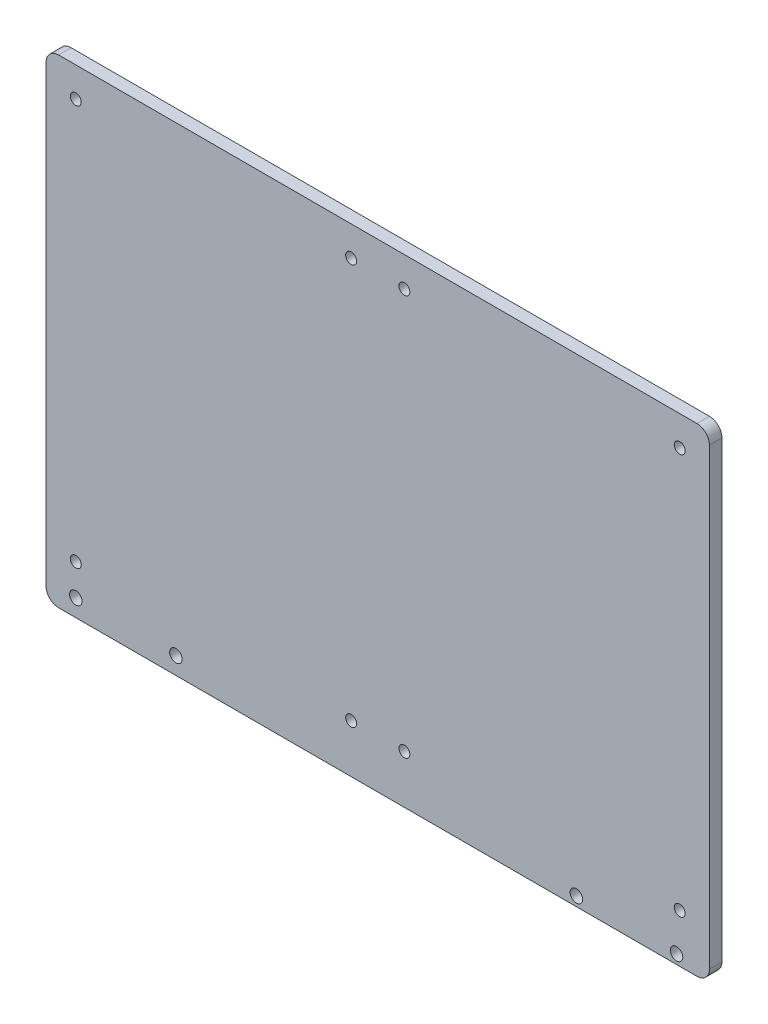
ISO-10303-21;
HEADER;
FILE_DESCRIPTION(('STEP AP214'),'2;1');
FILE_NAME('part.step','',(''),(''),'','','');
FILE_SCHEMA(('AUTOMOTIVE_DESIGN { 1 0 10303 214 1 1 1 1 }'));
ENDSEC;
DATA;
#1=APPLICATION_CONTEXT('core data for automotive mechanical design processes');
#2=APPLICATION_PROTOCOL_DEFINITION('international standard','automotive_design',2000,#1);
#3=PRODUCT_CONTEXT('',#1,'mechanical');
#4=PRODUCT('Part','Part','',(#3));
#5=PRODUCT_RELATED_PRODUCT_CATEGORY('part','',(#4));
#6=PRODUCT_DEFINITION_FORMATION('','',#4);
#7=PRODUCT_DEFINITION_CONTEXT('part definition',#1,'design');
#8=PRODUCT_DEFINITION('design','',#6,#7);
#9=PRODUCT_DEFINITION_SHAPE('','',#8);
#10=(LENGTH_UNIT() NAMED_UNIT(*) SI_UNIT(.MILLI.,.METRE.));
#11=(NAMED_UNIT(*) PLANE_ANGLE_UNIT() SI_UNIT($,.RADIAN.));
#12=(NAMED_UNIT(*) SI_UNIT($,.STERADIAN.) SOLID_ANGLE_UNIT());
#13=UNCERTAINTY_MEASURE_WITH_UNIT(LENGTH_MEASURE(1.E-05),#10,'distance_accuracy_value','');
#14=(GEOMETRIC_REPRESENTATION_CONTEXT(3) GLOBAL_UNCERTAINTY_ASSIGNED_CONTEXT((#13)) GLOBAL_UNIT_ASSIGNED_CONTEXT((#10,
#11,#12)) REPRESENTATION_CONTEXT('',''));
#15=CARTESIAN_POINT('',(0.,0.,0.));
#16=DIRECTION('',(0.,0.,1.));
#17=DIRECTION('',(1.,0.,0.));
#18=AXIS2_PLACEMENT_3D('',#15,#16,#17);
#19=CARTESIAN_POINT('',(0.,0.,4.));
#20=DIRECTION('',(0.,0.,1.));
#21=DIRECTION('',(1.,0.,0.));
#22=AXIS2_PLACEMENT_3D('',#19,#20,#21);
#23=PLANE('',#22);
#24=CARTESIAN_POINT('',(-64.5,-71.,4.));
#25=DIRECTION('',(0.,0.,1.));
#26=DIRECTION('',(1.,0.,0.));
#27=AXIS2_PLACEMENT_3D('',#24,#25,#26);
#28=CIRCLE('',#27,2.);
#29=CARTESIAN_POINT('',(-62.5,-71.,4.));
#30=VERTEX_POINT('',#29);
#31=EDGE_CURVE('E214',#30,#30,#28,.T.);
#32=ORIENTED_EDGE('',*,*,#31,.F.);
#33=EDGE_LOOP('',(#32));
#34=FACE_BOUND('',#33,.T.);
#35=CARTESIAN_POINT('',(-96.5,-71.,4.));
#36=DIRECTION('',(0.,0.,1.));
#37=DIRECTION('',(1.,0.,0.));
#38=AXIS2_PLACEMENT_3D('',#35,#36,#37);
#39=CIRCLE('',#38,2.);
#40=CARTESIAN_POINT('',(-94.5,-71.,4.));
#41=VERTEX_POINT('',#40);
#42=EDGE_CURVE('E226',#41,#41,#39,.T.);
#43=ORIENTED_EDGE('',*,*,#42,.F.);
#44=EDGE_LOOP('',(#43));
#45=FACE_BOUND('',#44,.T.);
#46=CARTESIAN_POINT('',(8.50000000000005,67.,4.));
#47=DIRECTION('',(0.,0.,1.));
#48=DIRECTION('',(-1.,0.,0.));
#49=AXIS2_PLACEMENT_3D('',#46,#47,#48);
#50=CIRCLE('',#49,1.75);
#51=CARTESIAN_POINT('',(6.75000000000005,67.,4.));
#52=VERTEX_POINT('',#51);
#53=EDGE_CURVE('E236',#52,#52,#50,.T.);
#54=ORIENTED_EDGE('',*,*,#53,.F.);
#55=EDGE_LOOP('',(#54));
#56=FACE_BOUND('',#55,.T.);
#57=CARTESIAN_POINT('',(-96.5,67.,4.));
#58=DIRECTION('',(0.,0.,1.));
#59=DIRECTION('',(-1.,0.,0.));
#60=AXIS2_PLACEMENT_3D('',#57,#58,#59);
#61=CIRCLE('',#60,1.75);
#62=CARTESIAN_POINT('',(-98.25,67.,4.));
#63=VERTEX_POINT('',#62);
#64=EDGE_CURVE('E246',#63,#63,#61,.T.);
#65=ORIENTED_EDGE('',*,*,#64,.F.);
#66=EDGE_LOOP('',(#65));
#67=FACE_BOUND('',#66,.T.);
#68=CARTESIAN_POINT('',(8.50000000000005,-61.,4.));
#69=DIRECTION('',(0.,0.,1.));
#70=DIRECTION('',(1.,0.,0.));
#71=AXIS2_PLACEMENT_3D('',#68,#69,#70);
#72=CIRCLE('',#71,1.75);
#73=CARTESIAN_POINT('',(10.25,-61.,4.));
#74=VERTEX_POINT('',#73);
#75=EDGE_CURVE('E256',#74,#74,#72,.T.);
#76=ORIENTED_EDGE('',*,*,#75,.F.);
#77=EDGE_LOOP('',(#76));
#78=FACE_BOUND('',#77,.T.);
#79=CARTESIAN_POINT('',(-96.5,-61.,4.));
#80=DIRECTION('',(0.,0.,1.));
#81=DIRECTION('',(1.,0.,0.));
#82=AXIS2_PLACEMENT_3D('',#79,#80,#81);
#83=CIRCLE('',#82,1.75);
#84=CARTESIAN_POINT('',(-94.75,-61.,4.));
#85=VERTEX_POINT('',#84);
#86=EDGE_CURVE('E136',#85,#85,#83,.T.);
#87=ORIENTED_EDGE('',*,*,#86,.F.);
#88=EDGE_LOOP('',(#87));
#89=FACE_BOUND('',#88,.T.);
#90=DIRECTION('',(0.,-1.,0.));
#91=VECTOR('',#90,1.);
#92=CARTESIAN_POINT('',(-106.,-76.5,4.));
#93=LINE('',#92,#91);
#94=CARTESIAN_POINT('',(-106.,72.4999999999999,4.));
#95=VERTEX_POINT('',#94);
#96=CARTESIAN_POINT('',(-106.,-72.5,4.));
#97=VERTEX_POINT('',#96);
#98=EDGE_CURVE('E141',#95,#97,#93,.T.);
#99=ORIENTED_EDGE('',*,*,#98,.T.);
#100=CARTESIAN_POINT('',(-102.,-72.5,4.));
#101=DIRECTION('',(0.,0.,1.));
#102=DIRECTION('',(1.,0.,0.));
#103=AXIS2_PLACEMENT_3D('',#100,#101,#102);
#104=CIRCLE('',#103,4.);
#105=CARTESIAN_POINT('',(-102.,-76.5,4.));
#106=VERTEX_POINT('',#105);
#107=EDGE_CURVE('E156',#97,#106,#104,.T.);
#108=ORIENTED_EDGE('',*,*,#107,.T.);
#109=DIRECTION('',(1.,0.,0.));
#110=VECTOR('',#109,1.);
#111=CARTESIAN_POINT('',(106.,-76.5,4.));
#112=LINE('',#111,#110);
#113=CARTESIAN_POINT('',(102.,-76.5,4.));
#114=VERTEX_POINT('',#113);
#115=EDGE_CURVE('E123',#106,#114,#112,.T.);
#116=ORIENTED_EDGE('',*,*,#115,.T.);
#117=CARTESIAN_POINT('',(102.,-72.5,4.));
#118=DIRECTION('',(0.,0.,1.));
#119=DIRECTION('',(1.,0.,0.));
#120=AXIS2_PLACEMENT_3D('',#117,#118,#119);
#121=CIRCLE('',#120,4.);
#122=CARTESIAN_POINT('',(106.,-72.5,4.));
#123=VERTEX_POINT('',#122);
#124=EDGE_CURVE('E154',#114,#123,#121,.T.);
#125=ORIENTED_EDGE('',*,*,#124,.T.);
#126=DIRECTION('',(0.,1.,0.));
#127=VECTOR('',#126,1.);
#128=CARTESIAN_POINT('',(106.,-76.5,4.));
#129=LINE('',#128,#127);
#130=CARTESIAN_POINT('',(106.,72.5,4.));
#131=VERTEX_POINT('',#130);
#132=EDGE_CURVE('E176',#123,#131,#129,.T.);
#133=ORIENTED_EDGE('',*,*,#132,.T.);
#134=CARTESIAN_POINT('',(102.,72.5,4.));
#135=DIRECTION('',(0.,0.,1.));
#136=DIRECTION('',(1.,0.,0.));
#137=AXIS2_PLACEMENT_3D('',#134,#135,#136);
#138=CIRCLE('',#137,4.);
#139=CARTESIAN_POINT('',(102.,76.5,4.));
#140=VERTEX_POINT('',#139);
#141=EDGE_CURVE('E58',#131,#140,#138,.T.);
#142=ORIENTED_EDGE('',*,*,#141,.T.);
#143=DIRECTION('',(-1.,0.,0.));
#144=VECTOR('',#143,1.);
#145=CARTESIAN_POINT('',(106.,76.5,4.));
#146=LINE('',#145,#144);
#147=CARTESIAN_POINT('',(-102.,76.4999999999999,4.));
#148=VERTEX_POINT('',#147);
#149=EDGE_CURVE('E142',#140,#148,#146,.T.);
#150=ORIENTED_EDGE('',*,*,#149,.T.);
#151=CARTESIAN_POINT('',(-102.,72.4999999999999,4.));
#152=DIRECTION('',(0.,0.,1.));
#153=DIRECTION('',(1.,0.,0.));
#154=AXIS2_PLACEMENT_3D('',#151,#152,#153);
#155=CIRCLE('',#154,4.);
#156=EDGE_CURVE('E152',#148,#95,#155,.T.);
#157=ORIENTED_EDGE('',*,*,#156,.T.);
#158=EDGE_LOOP('',(#99,#108,#116,#125,#133,#142,#150,#157));
#159=FACE_BOUND('',#158,.T.);
#160=CARTESIAN_POINT('',(-8.50000000000002,-61.,4.));
#161=DIRECTION('',(0.,0.,1.));
#162=DIRECTION('',(-1.,0.,0.));
#163=AXIS2_PLACEMENT_3D('',#160,#161,#162);
#164=CIRCLE('',#163,1.75);
#165=CARTESIAN_POINT('',(-10.25,-61.,4.));
#166=VERTEX_POINT('',#165);
#167=EDGE_CURVE('E189',#166,#166,#164,.T.);
#168=ORIENTED_EDGE('',*,*,#167,.F.);
#169=EDGE_LOOP('',(#168));
#170=FACE_BOUND('',#169,.T.);
#171=CARTESIAN_POINT('',(96.5000000000001,-61.,4.));
#172=DIRECTION('',(0.,0.,1.));
#173=DIRECTION('',(-1.,0.,0.));
#174=AXIS2_PLACEMENT_3D('',#171,#172,#173);
#175=CIRCLE('',#174,1.75);
#176=CARTESIAN_POINT('',(94.7500000000001,-61.,4.));
#177=VERTEX_POINT('',#176);
#178=EDGE_CURVE('E193',#177,#177,#175,.T.);
#179=ORIENTED_EDGE('',*,*,#178,.F.);
#180=EDGE_LOOP('',(#179));
#181=FACE_BOUND('',#180,.T.);
#182=CARTESIAN_POINT('',(96.5000000000001,67.,4.));
#183=DIRECTION('',(0.,0.,1.));
#184=DIRECTION('',(1.,0.,0.));
#185=AXIS2_PLACEMENT_3D('',#182,#183,#184);
#186=CIRCLE('',#185,1.75);
#187=CARTESIAN_POINT('',(98.2500000000001,67.,4.));
#188=VERTEX_POINT('',#187);
#189=EDGE_CURVE('E197',#188,#188,#186,.T.);
#190=ORIENTED_EDGE('',*,*,#189,.F.);
#191=EDGE_LOOP('',(#190));
#192=FACE_BOUND('',#191,.T.);
#193=CARTESIAN_POINT('',(-8.50000000000002,67.,4.));
#194=DIRECTION('',(0.,0.,1.));
#195=DIRECTION('',(1.,0.,0.));
#196=AXIS2_PLACEMENT_3D('',#193,#194,#195);
#197=CIRCLE('',#196,1.75);
#198=CARTESIAN_POINT('',(-6.75000000000002,67.,4.));
#199=VERTEX_POINT('',#198);
#200=EDGE_CURVE('E201',#199,#199,#197,.T.);
#201=ORIENTED_EDGE('',*,*,#200,.F.);
#202=EDGE_LOOP('',(#201));
#203=FACE_BOUND('',#202,.T.);
#204=CARTESIAN_POINT('',(95.4803109760698,-73.51,4.));
#205=DIRECTION('',(0.,0.,1.));
#206=DIRECTION('',(-1.,0.,0.));
#207=AXIS2_PLACEMENT_3D('',#204,#205,#206);
#208=CIRCLE('',#207,2.);
#209=CARTESIAN_POINT('',(93.4803109760698,-73.51,4.));
#210=VERTEX_POINT('',#209);
#211=EDGE_CURVE('E205',#210,#210,#208,.T.);
#212=ORIENTED_EDGE('',*,*,#211,.F.);
#213=EDGE_LOOP('',(#212));
#214=FACE_BOUND('',#213,.T.);
#215=CARTESIAN_POINT('',(63.4803109760698,-73.51,4.));
#216=DIRECTION('',(0.,0.,1.));
#217=DIRECTION('',(1.,0.,0.));
#218=AXIS2_PLACEMENT_3D('',#215,#216,#217);
#219=CIRCLE('',#218,2.);
#220=CARTESIAN_POINT('',(65.4803109760698,-73.51,4.));
#221=VERTEX_POINT('',#220);
#222=EDGE_CURVE('E208',#221,#221,#219,.T.);
#223=ORIENTED_EDGE('',*,*,#222,.F.);
#224=EDGE_LOOP('',(#223));
#225=FACE_BOUND('',#224,.T.);
#226=ADVANCED_FACE('F38',(#34,#45,#56,#67,#78,#89,#159,#170,#181,#192,#203,#214,#225),#23,.T.);
#227=CARTESIAN_POINT('',(0.,0.,0.));
#228=DIRECTION('',(0.,0.,1.));
#229=DIRECTION('',(1.,0.,0.));
#230=AXIS2_PLACEMENT_3D('',#227,#228,#229);
#231=PLANE('',#230);
#232=DIRECTION('',(1.,0.,0.));
#233=VECTOR('',#232,1.);
#234=CARTESIAN_POINT('',(106.,-76.5,0.));
#235=LINE('',#234,#233);
#236=CARTESIAN_POINT('',(-102.,-76.5,0.));
#237=VERTEX_POINT('',#236);
#238=CARTESIAN_POINT('',(102.,-76.5,0.));
#239=VERTEX_POINT('',#238);
#240=EDGE_CURVE('E120',#237,#239,#235,.T.);
#241=ORIENTED_EDGE('',*,*,#240,.F.);
#242=CARTESIAN_POINT('',(-102.,-72.5,0.));
#243=DIRECTION('',(0.,0.,1.));
#244=DIRECTION('',(1.,0.,0.));
#245=AXIS2_PLACEMENT_3D('',#242,#243,#244);
#246=CIRCLE('',#245,4.);
#247=CARTESIAN_POINT('',(-106.,-72.5,0.));
#248=VERTEX_POINT('',#247);
#249=EDGE_CURVE('E103',#237,#248,#246,.F.);
#250=ORIENTED_EDGE('',*,*,#249,.T.);
#251=DIRECTION('',(0.,-1.,0.));
#252=VECTOR('',#251,1.);
#253=CARTESIAN_POINT('',(-106.,-76.5,0.));
#254=LINE('',#253,#252);
#255=CARTESIAN_POINT('',(-106.,72.4999999999999,0.));
#256=VERTEX_POINT('',#255);
#257=EDGE_CURVE('E131',#256,#248,#254,.T.);
#258=ORIENTED_EDGE('',*,*,#257,.F.);
#259=CARTESIAN_POINT('',(-102.,72.4999999999999,0.));
#260=DIRECTION('',(0.,0.,1.));
#261=DIRECTION('',(1.,0.,0.));
#262=AXIS2_PLACEMENT_3D('',#259,#260,#261);
#263=CIRCLE('',#262,4.);
#264=CARTESIAN_POINT('',(-102.,76.4999999999999,0.));
#265=VERTEX_POINT('',#264);
#266=EDGE_CURVE('E145',#256,#265,#263,.F.);
#267=ORIENTED_EDGE('',*,*,#266,.T.);
#268=DIRECTION('',(-1.,0.,0.));
#269=VECTOR('',#268,1.);
#270=CARTESIAN_POINT('',(106.,76.5,0.));
#271=LINE('',#270,#269);
#272=CARTESIAN_POINT('',(102.,76.5,0.));
#273=VERTEX_POINT('',#272);
#274=EDGE_CURVE('E134',#273,#265,#271,.T.);
#275=ORIENTED_EDGE('',*,*,#274,.F.);
#276=CARTESIAN_POINT('',(102.,72.5,0.));
#277=DIRECTION('',(0.,0.,1.));
#278=DIRECTION('',(1.,0.,0.));
#279=AXIS2_PLACEMENT_3D('',#276,#277,#278);
#280=CIRCLE('',#279,4.);
#281=CARTESIAN_POINT('',(106.,72.5,0.));
#282=VERTEX_POINT('',#281);
#283=EDGE_CURVE('E124',#273,#282,#280,.F.);
#284=ORIENTED_EDGE('',*,*,#283,.T.);
#285=DIRECTION('',(0.,1.,0.));
#286=VECTOR('',#285,1.);
#287=CARTESIAN_POINT('',(106.,-76.5,0.));
#288=LINE('',#287,#286);
#289=CARTESIAN_POINT('',(106.,-72.5,0.));
#290=VERTEX_POINT('',#289);
#291=EDGE_CURVE('E130',#290,#282,#288,.T.);
#292=ORIENTED_EDGE('',*,*,#291,.F.);
#293=CARTESIAN_POINT('',(102.,-72.5,0.));
#294=DIRECTION('',(0.,0.,1.));
#295=DIRECTION('',(1.,0.,0.));
#296=AXIS2_PLACEMENT_3D('',#293,#294,#295);
#297=CIRCLE('',#296,4.);
#298=EDGE_CURVE('E114',#290,#239,#297,.F.);
#299=ORIENTED_EDGE('',*,*,#298,.T.);
#300=EDGE_LOOP('',(#241,#250,#258,#267,#275,#284,#292,#299));
#301=FACE_BOUND('',#300,.T.);
#302=CARTESIAN_POINT('',(-96.5,-61.,0.));
#303=DIRECTION('',(0.,0.,1.));
#304=DIRECTION('',(1.,0.,0.));
#305=AXIS2_PLACEMENT_3D('',#302,#303,#304);
#306=CIRCLE('',#305,1.75);
#307=CARTESIAN_POINT('',(-94.75,-61.,0.));
#308=VERTEX_POINT('',#307);
#309=EDGE_CURVE('E179',#308,#308,#306,.T.);
#310=ORIENTED_EDGE('',*,*,#309,.T.);
#311=EDGE_LOOP('',(#310));
#312=FACE_BOUND('',#311,.T.);
#313=CARTESIAN_POINT('',(-8.50000000000002,-61.,0.));
#314=DIRECTION('',(0.,0.,1.));
#315=DIRECTION('',(-1.,0.,0.));
#316=AXIS2_PLACEMENT_3D('',#313,#314,#315);
#317=CIRCLE('',#316,1.75);
#318=CARTESIAN_POINT('',(-10.25,-61.,0.));
#319=VERTEX_POINT('',#318);
#320=EDGE_CURVE('E259',#319,#319,#317,.T.);
#321=ORIENTED_EDGE('',*,*,#320,.T.);
#322=EDGE_LOOP('',(#321));
#323=FACE_BOUND('',#322,.T.);
#324=CARTESIAN_POINT('',(8.50000000000005,-61.,0.));
#325=DIRECTION('',(0.,0.,1.));
#326=DIRECTION('',(1.,0.,0.));
#327=AXIS2_PLACEMENT_3D('',#324,#325,#326);
#328=CIRCLE('',#327,1.75);
#329=CARTESIAN_POINT('',(10.25,-61.,0.));
#330=VERTEX_POINT('',#329);
#331=EDGE_CURVE('E253',#330,#330,#328,.T.);
#332=ORIENTED_EDGE('',*,*,#331,.T.);
#333=EDGE_LOOP('',(#332));
#334=FACE_BOUND('',#333,.T.);
#335=CARTESIAN_POINT('',(96.5000000000001,-61.,0.));
#336=DIRECTION('',(0.,0.,1.));
#337=DIRECTION('',(-1.,0.,0.));
#338=AXIS2_PLACEMENT_3D('',#335,#336,#337);
#339=CIRCLE('',#338,1.75);
#340=CARTESIAN_POINT('',(94.7500000000001,-61.,0.));
#341=VERTEX_POINT('',#340);
#342=EDGE_CURVE('E249',#341,#341,#339,.T.);
#343=ORIENTED_EDGE('',*,*,#342,.T.);
#344=EDGE_LOOP('',(#343));
#345=FACE_BOUND('',#344,.T.);
#346=CARTESIAN_POINT('',(-96.5,67.,0.));
#347=DIRECTION('',(0.,0.,1.));
#348=DIRECTION('',(-1.,0.,0.));
#349=AXIS2_PLACEMENT_3D('',#346,#347,#348);
#350=CIRCLE('',#349,1.75);
#351=CARTESIAN_POINT('',(-98.25,67.,0.));
#352=VERTEX_POINT('',#351);
#353=EDGE_CURVE('E243',#352,#352,#350,.T.);
#354=ORIENTED_EDGE('',*,*,#353,.T.);
#355=EDGE_LOOP('',(#354));
#356=FACE_BOUND('',#355,.T.);
#357=CARTESIAN_POINT('',(96.5000000000001,67.,0.));
#358=DIRECTION('',(0.,0.,1.));
#359=DIRECTION('',(1.,0.,0.));
#360=AXIS2_PLACEMENT_3D('',#357,#358,#359);
#361=CIRCLE('',#360,1.75);
#362=CARTESIAN_POINT('',(98.2500000000001,67.,0.));
#363=VERTEX_POINT('',#362);
#364=EDGE_CURVE('E239',#363,#363,#361,.T.);
#365=ORIENTED_EDGE('',*,*,#364,.T.);
#366=EDGE_LOOP('',(#365));
#367=FACE_BOUND('',#366,.T.);
#368=CARTESIAN_POINT('',(8.50000000000005,67.,0.));
#369=DIRECTION('',(0.,0.,1.));
#370=DIRECTION('',(-1.,0.,0.));
#371=AXIS2_PLACEMENT_3D('',#368,#369,#370);
#372=CIRCLE('',#371,1.75);
#373=CARTESIAN_POINT('',(6.75000000000005,67.,0.));
#374=VERTEX_POINT('',#373);
#375=EDGE_CURVE('E233',#374,#374,#372,.T.);
#376=ORIENTED_EDGE('',*,*,#375,.T.);
#377=EDGE_LOOP('',(#376));
#378=FACE_BOUND('',#377,.T.);
#379=CARTESIAN_POINT('',(-8.50000000000002,67.,0.));
#380=DIRECTION('',(0.,0.,1.));
#381=DIRECTION('',(1.,0.,0.));
#382=AXIS2_PLACEMENT_3D('',#379,#380,#381);
#383=CIRCLE('',#382,1.75);
#384=CARTESIAN_POINT('',(-6.75000000000002,67.,0.));
#385=VERTEX_POINT('',#384);
#386=EDGE_CURVE('E229',#385,#385,#383,.T.);
#387=ORIENTED_EDGE('',*,*,#386,.T.);
#388=EDGE_LOOP('',(#387));
#389=FACE_BOUND('',#388,.T.);
#390=CARTESIAN_POINT('',(-96.5,-71.,0.));
#391=DIRECTION('',(0.,0.,1.));
#392=DIRECTION('',(1.,0.,0.));
#393=AXIS2_PLACEMENT_3D('',#390,#391,#392);
#394=CIRCLE('',#393,2.);
#395=CARTESIAN_POINT('',(-94.5,-71.,0.));
#396=VERTEX_POINT('',#395);
#397=EDGE_CURVE('E223',#396,#396,#394,.T.);
#398=ORIENTED_EDGE('',*,*,#397,.T.);
#399=EDGE_LOOP('',(#398));
#400=FACE_BOUND('',#399,.T.);
#401=CARTESIAN_POINT('',(95.4803109760698,-73.51,0.));
#402=DIRECTION('',(0.,0.,1.));
#403=DIRECTION('',(-1.,0.,0.));
#404=AXIS2_PLACEMENT_3D('',#401,#402,#403);
#405=CIRCLE('',#404,2.);
#406=CARTESIAN_POINT('',(93.4803109760698,-73.51,0.));
#407=VERTEX_POINT('',#406);
#408=EDGE_CURVE('E220',#407,#407,#405,.T.);
#409=ORIENTED_EDGE('',*,*,#408,.T.);
#410=EDGE_LOOP('',(#409));
#411=FACE_BOUND('',#410,.T.);
#412=CARTESIAN_POINT('',(-64.5,-71.,0.));
#413=DIRECTION('',(0.,0.,1.));
#414=DIRECTION('',(1.,0.,0.));
#415=AXIS2_PLACEMENT_3D('',#412,#413,#414);
#416=CIRCLE('',#415,2.);
#417=CARTESIAN_POINT('',(-62.5,-71.,0.));
#418=VERTEX_POINT('',#417);
#419=EDGE_CURVE('E210',#418,#418,#416,.T.);
#420=ORIENTED_EDGE('',*,*,#419,.T.);
#421=EDGE_LOOP('',(#420));
#422=FACE_BOUND('',#421,.T.);
#423=CARTESIAN_POINT('',(63.4803109760698,-73.51,0.));
#424=DIRECTION('',(0.,0.,1.));
#425=DIRECTION('',(1.,0.,0.));
#426=AXIS2_PLACEMENT_3D('',#423,#424,#425);
#427=CIRCLE('',#426,2.);
#428=CARTESIAN_POINT('',(65.4803109760698,-73.51,0.));
#429=VERTEX_POINT('',#428);
#430=EDGE_CURVE('E211',#429,#429,#427,.T.);
#431=ORIENTED_EDGE('',*,*,#430,.T.);
#432=EDGE_LOOP('',(#431));
#433=FACE_BOUND('',#432,.T.);
#434=ADVANCED_FACE('F127',(#301,#312,#323,#334,#345,#356,#367,#378,#389,#400,#411,#422,#433),
#231,.F.);
#435=CARTESIAN_POINT('',(-106.,-76.5,4.));
#436=DIRECTION('',(1.,0.,0.));
#437=DIRECTION('',(0.,1.,0.));
#438=AXIS2_PLACEMENT_3D('',#435,#436,#437);
#439=PLANE('',#438);
#440=ORIENTED_EDGE('',*,*,#257,.T.);
#441=DIRECTION('',(0.,0.,-1.));
#442=VECTOR('',#441,1.);
#443=CARTESIAN_POINT('',(-106.,-72.5,4.));
#444=LINE('',#443,#442);
#445=EDGE_CURVE('E108',#248,#97,#444,.F.);
#446=ORIENTED_EDGE('',*,*,#445,.T.);
#447=ORIENTED_EDGE('',*,*,#98,.F.);
#448=DIRECTION('',(0.,0.,-1.));
#449=VECTOR('',#448,1.);
#450=CARTESIAN_POINT('',(-106.,72.4999999999999,4.));
#451=LINE('',#450,#449);
#452=EDGE_CURVE('E113',#95,#256,#451,.T.);
#453=ORIENTED_EDGE('',*,*,#452,.T.);
#454=EDGE_LOOP('',(#440,#446,#447,#453));
#455=FACE_BOUND('',#454,.T.);
#456=ADVANCED_FACE('F173',(#455),#439,.F.);
#457=CARTESIAN_POINT('',(106.,-76.5,4.));
#458=DIRECTION('',(0.,1.,0.));
#459=DIRECTION('',(-1.,0.,0.));
#460=AXIS2_PLACEMENT_3D('',#457,#458,#459);
#461=PLANE('',#460);
#462=ORIENTED_EDGE('',*,*,#115,.F.);
#463=DIRECTION('',(0.,0.,-1.));
#464=VECTOR('',#463,1.);
#465=CARTESIAN_POINT('',(-102.,-76.5,4.));
#466=LINE('',#465,#464);
#467=EDGE_CURVE('E107',#106,#237,#466,.T.);
#468=ORIENTED_EDGE('',*,*,#467,.T.);
#469=ORIENTED_EDGE('',*,*,#240,.T.);
#470=DIRECTION('',(0.,0.,-1.));
#471=VECTOR('',#470,1.);
#472=CARTESIAN_POINT('',(102.,-76.5,4.));
#473=LINE('',#472,#471);
#474=EDGE_CURVE('E125',#239,#114,#473,.F.);
#475=ORIENTED_EDGE('',*,*,#474,.T.);
#476=EDGE_LOOP('',(#462,#468,#469,#475));
#477=FACE_BOUND('',#476,.T.);
#478=ADVANCED_FACE('F119',(#477),#461,.F.);
#479=CARTESIAN_POINT('',(106.,-76.5,4.));
#480=DIRECTION('',(-1.,0.,0.));
#481=DIRECTION('',(0.,-1.,0.));
#482=AXIS2_PLACEMENT_3D('',#479,#480,#481);
#483=PLANE('',#482);
#484=ORIENTED_EDGE('',*,*,#132,.F.);
#485=DIRECTION('',(0.,0.,-1.));
#486=VECTOR('',#485,1.);
#487=CARTESIAN_POINT('',(106.,-72.5,4.));
#488=LINE('',#487,#486);
#489=EDGE_CURVE('E160',#123,#290,#488,.T.);
#490=ORIENTED_EDGE('',*,*,#489,.T.);
#491=ORIENTED_EDGE('',*,*,#291,.T.);
#492=DIRECTION('',(0.,0.,-1.));
#493=VECTOR('',#492,1.);
#494=CARTESIAN_POINT('',(106.,72.5,4.));
#495=LINE('',#494,#493);
#496=EDGE_CURVE('E158',#282,#131,#495,.F.);
#497=ORIENTED_EDGE('',*,*,#496,.T.);
#498=EDGE_LOOP('',(#484,#490,#491,#497));
#499=FACE_BOUND('',#498,.T.);
#500=ADVANCED_FACE('F282',(#499),#483,.F.);
#501=CARTESIAN_POINT('',(106.,76.5,4.));
#502=DIRECTION('',(0.,-1.,0.));
#503=DIRECTION('',(1.,0.,0.));
#504=AXIS2_PLACEMENT_3D('',#501,#502,#503);
#505=PLANE('',#504);
#506=ORIENTED_EDGE('',*,*,#274,.T.);
#507=DIRECTION('',(0.,0.,-1.));
#508=VECTOR('',#507,1.);
#509=CARTESIAN_POINT('',(-102.,76.4999999999999,4.));
#510=LINE('',#509,#508);
#511=EDGE_CURVE('E11',#265,#148,#510,.F.);
#512=ORIENTED_EDGE('',*,*,#511,.T.);
#513=ORIENTED_EDGE('',*,*,#149,.F.);
#514=DIRECTION('',(0.,0.,-1.));
#515=VECTOR('',#514,1.);
#516=CARTESIAN_POINT('',(102.,76.5,4.));
#517=LINE('',#516,#515);
#518=EDGE_CURVE('E46',#140,#273,#517,.T.);
#519=ORIENTED_EDGE('',*,*,#518,.T.);
#520=EDGE_LOOP('',(#506,#512,#513,#519));
#521=FACE_BOUND('',#520,.T.);
#522=ADVANCED_FACE('F165',(#521),#505,.F.);
#523=CARTESIAN_POINT('',(-96.5,-61.,4.));
#524=DIRECTION('',(0.,0.,-1.));
#525=DIRECTION('',(-1.,0.,0.));
#526=AXIS2_PLACEMENT_3D('',#523,#524,#525);
#527=CYLINDRICAL_SURFACE('',#526,1.75);
#528=ORIENTED_EDGE('',*,*,#86,.T.);
#529=EDGE_LOOP('',(#528));
#530=FACE_BOUND('',#529,.T.);
#531=ORIENTED_EDGE('',*,*,#309,.F.);
#532=EDGE_LOOP('',(#531));
#533=FACE_BOUND('',#532,.T.);
#534=ADVANCED_FACE('F271',(#530,#533),#527,.F.);
#535=CARTESIAN_POINT('',(-8.50000000000002,-61.,4.));
#536=DIRECTION('',(0.,0.,-1.));
#537=DIRECTION('',(-1.,0.,0.));
#538=AXIS2_PLACEMENT_3D('',#535,#536,#537);
#539=CYLINDRICAL_SURFACE('',#538,1.75);
#540=ORIENTED_EDGE('',*,*,#167,.T.);
#541=EDGE_LOOP('',(#540));
#542=FACE_BOUND('',#541,.T.);
#543=ORIENTED_EDGE('',*,*,#320,.F.);
#544=EDGE_LOOP('',(#543));
#545=FACE_BOUND('',#544,.T.);
#546=ADVANCED_FACE('F273',(#542,#545),#539,.F.);
#547=CARTESIAN_POINT('',(8.50000000000005,-61.,4.));
#548=DIRECTION('',(0.,0.,-1.));
#549=DIRECTION('',(-1.,0.,0.));
#550=AXIS2_PLACEMENT_3D('',#547,#548,#549);
#551=CYLINDRICAL_SURFACE('',#550,1.75);
#552=ORIENTED_EDGE('',*,*,#75,.T.);
#553=EDGE_LOOP('',(#552));
#554=FACE_BOUND('',#553,.T.);
#555=ORIENTED_EDGE('',*,*,#331,.F.);
#556=EDGE_LOOP('',(#555));
#557=FACE_BOUND('',#556,.T.);
#558=ADVANCED_FACE('F279',(#554,#557),#551,.F.);
#559=CARTESIAN_POINT('',(96.5000000000001,-61.,4.));
#560=DIRECTION('',(0.,0.,-1.));
#561=DIRECTION('',(-1.,0.,0.));
#562=AXIS2_PLACEMENT_3D('',#559,#560,#561);
#563=CYLINDRICAL_SURFACE('',#562,1.75);
#564=ORIENTED_EDGE('',*,*,#178,.T.);
#565=EDGE_LOOP('',(#564));
#566=FACE_BOUND('',#565,.T.);
#567=ORIENTED_EDGE('',*,*,#342,.F.);
#568=EDGE_LOOP('',(#567));
#569=FACE_BOUND('',#568,.T.);
#570=ADVANCED_FACE('F442',(#566,#569),#563,.F.);
#571=CARTESIAN_POINT('',(-96.5,67.,4.));
#572=DIRECTION('',(0.,0.,-1.));
#573=DIRECTION('',(-1.,0.,0.));
#574=AXIS2_PLACEMENT_3D('',#571,#572,#573);
#575=CYLINDRICAL_SURFACE('',#574,1.75);
#576=ORIENTED_EDGE('',*,*,#64,.T.);
#577=EDGE_LOOP('',(#576));
#578=FACE_BOUND('',#577,.T.);
#579=ORIENTED_EDGE('',*,*,#353,.F.);
#580=EDGE_LOOP('',(#579));
#581=FACE_BOUND('',#580,.T.);
#582=ADVANCED_FACE('F432',(#578,#581),#575,.F.);
#583=CARTESIAN_POINT('',(96.5000000000001,67.,4.));
#584=DIRECTION('',(0.,0.,-1.));
#585=DIRECTION('',(-1.,0.,0.));
#586=AXIS2_PLACEMENT_3D('',#583,#584,#585);
#587=CYLINDRICAL_SURFACE('',#586,1.75);
#588=ORIENTED_EDGE('',*,*,#189,.T.);
#589=EDGE_LOOP('',(#588));
#590=FACE_BOUND('',#589,.T.);
#591=ORIENTED_EDGE('',*,*,#364,.F.);
#592=EDGE_LOOP('',(#591));
#593=FACE_BOUND('',#592,.T.);
#594=ADVANCED_FACE('F422',(#590,#593),#587,.F.);
#595=CARTESIAN_POINT('',(8.50000000000005,67.,4.));
#596=DIRECTION('',(0.,0.,-1.));
#597=DIRECTION('',(-1.,0.,0.));
#598=AXIS2_PLACEMENT_3D('',#595,#596,#597);
#599=CYLINDRICAL_SURFACE('',#598,1.75);
#600=ORIENTED_EDGE('',*,*,#53,.T.);
#601=EDGE_LOOP('',(#600));
#602=FACE_BOUND('',#601,.T.);
#603=ORIENTED_EDGE('',*,*,#375,.F.);
#604=EDGE_LOOP('',(#603));
#605=FACE_BOUND('',#604,.T.);
#606=ADVANCED_FACE('F412',(#602,#605),#599,.F.);
#607=CARTESIAN_POINT('',(-8.50000000000002,67.,4.));
#608=DIRECTION('',(0.,0.,-1.));
#609=DIRECTION('',(-1.,0.,0.));
#610=AXIS2_PLACEMENT_3D('',#607,#608,#609);
#611=CYLINDRICAL_SURFACE('',#610,1.75);
#612=ORIENTED_EDGE('',*,*,#200,.T.);
#613=EDGE_LOOP('',(#612));
#614=FACE_BOUND('',#613,.T.);
#615=ORIENTED_EDGE('',*,*,#386,.F.);
#616=EDGE_LOOP('',(#615));
#617=FACE_BOUND('',#616,.T.);
#618=ADVANCED_FACE('F402',(#614,#617),#611,.F.);
#619=CARTESIAN_POINT('',(-96.5,-71.,4.));
#620=DIRECTION('',(0.,0.,-1.));
#621=DIRECTION('',(-1.,0.,0.));
#622=AXIS2_PLACEMENT_3D('',#619,#620,#621);
#623=CYLINDRICAL_SURFACE('',#622,2.);
#624=ORIENTED_EDGE('',*,*,#42,.T.);
#625=EDGE_LOOP('',(#624));
#626=FACE_BOUND('',#625,.T.);
#627=ORIENTED_EDGE('',*,*,#397,.F.);
#628=EDGE_LOOP('',(#627));
#629=FACE_BOUND('',#628,.T.);
#630=ADVANCED_FACE('F392',(#626,#629),#623,.F.);
#631=CARTESIAN_POINT('',(95.4803109760698,-73.51,4.));
#632=DIRECTION('',(0.,0.,-1.));
#633=DIRECTION('',(-1.,0.,0.));
#634=AXIS2_PLACEMENT_3D('',#631,#632,#633);
#635=CYLINDRICAL_SURFACE('',#634,2.);
#636=ORIENTED_EDGE('',*,*,#211,.T.);
#637=EDGE_LOOP('',(#636));
#638=FACE_BOUND('',#637,.T.);
#639=ORIENTED_EDGE('',*,*,#408,.F.);
#640=EDGE_LOOP('',(#639));
#641=FACE_BOUND('',#640,.T.);
#642=ADVANCED_FACE('F382',(#638,#641),#635,.F.);
#643=CARTESIAN_POINT('',(-64.5,-71.,4.));
#644=DIRECTION('',(0.,0.,-1.));
#645=DIRECTION('',(-1.,0.,0.));
#646=AXIS2_PLACEMENT_3D('',#643,#644,#645);
#647=CYLINDRICAL_SURFACE('',#646,2.);
#648=ORIENTED_EDGE('',*,*,#31,.T.);
#649=EDGE_LOOP('',(#648));
#650=FACE_BOUND('',#649,.T.);
#651=ORIENTED_EDGE('',*,*,#419,.F.);
#652=EDGE_LOOP('',(#651));
#653=FACE_BOUND('',#652,.T.);
#654=ADVANCED_FACE('F373',(#650,#653),#647,.F.);
#655=CARTESIAN_POINT('',(63.4803109760698,-73.51,4.));
#656=DIRECTION('',(0.,0.,-1.));
#657=DIRECTION('',(-1.,0.,0.));
#658=AXIS2_PLACEMENT_3D('',#655,#656,#657);
#659=CYLINDRICAL_SURFACE('',#658,2.);
#660=ORIENTED_EDGE('',*,*,#222,.T.);
#661=EDGE_LOOP('',(#660));
#662=FACE_BOUND('',#661,.T.);
#663=ORIENTED_EDGE('',*,*,#430,.F.);
#664=EDGE_LOOP('',(#663));
#665=FACE_BOUND('',#664,.T.);
#666=ADVANCED_FACE('F298',(#662,#665),#659,.F.);
#667=CARTESIAN_POINT('',(-102.,-72.5,4.));
#668=DIRECTION('',(0.,0.,-1.));
#669=DIRECTION('',(-1.,0.,0.));
#670=AXIS2_PLACEMENT_3D('',#667,#668,#669);
#671=CYLINDRICAL_SURFACE('',#670,4.);
#672=ORIENTED_EDGE('',*,*,#107,.F.);
#673=ORIENTED_EDGE('',*,*,#445,.F.);
#674=ORIENTED_EDGE('',*,*,#249,.F.);
#675=ORIENTED_EDGE('',*,*,#467,.F.);
#676=EDGE_LOOP('',(#672,#673,#674,#675));
#677=FACE_BOUND('',#676,.T.);
#678=ADVANCED_FACE('F106',(#677),#671,.T.);
#679=CARTESIAN_POINT('',(102.,-72.5,4.));
#680=DIRECTION('',(0.,0.,-1.));
#681=DIRECTION('',(-1.,0.,0.));
#682=AXIS2_PLACEMENT_3D('',#679,#680,#681);
#683=CYLINDRICAL_SURFACE('',#682,4.);
#684=ORIENTED_EDGE('',*,*,#124,.F.);
#685=ORIENTED_EDGE('',*,*,#474,.F.);
#686=ORIENTED_EDGE('',*,*,#298,.F.);
#687=ORIENTED_EDGE('',*,*,#489,.F.);
#688=EDGE_LOOP('',(#684,#685,#686,#687));
#689=FACE_BOUND('',#688,.T.);
#690=ADVANCED_FACE('F297',(#689),#683,.T.);
#691=CARTESIAN_POINT('',(-102.,72.4999999999999,4.));
#692=DIRECTION('',(0.,0.,-1.));
#693=DIRECTION('',(-1.,0.,0.));
#694=AXIS2_PLACEMENT_3D('',#691,#692,#693);
#695=CYLINDRICAL_SURFACE('',#694,4.);
#696=ORIENTED_EDGE('',*,*,#156,.F.);
#697=ORIENTED_EDGE('',*,*,#511,.F.);
#698=ORIENTED_EDGE('',*,*,#266,.F.);
#699=ORIENTED_EDGE('',*,*,#452,.F.);
#700=EDGE_LOOP('',(#696,#697,#698,#699));
#701=FACE_BOUND('',#700,.T.);
#702=ADVANCED_FACE('F170',(#701),#695,.T.);
#703=CARTESIAN_POINT('',(102.,72.5,4.));
#704=DIRECTION('',(0.,0.,-1.));
#705=DIRECTION('',(-1.,0.,0.));
#706=AXIS2_PLACEMENT_3D('',#703,#704,#705);
#707=CYLINDRICAL_SURFACE('',#706,4.);
#708=ORIENTED_EDGE('',*,*,#141,.F.);
#709=ORIENTED_EDGE('',*,*,#496,.F.);
#710=ORIENTED_EDGE('',*,*,#283,.F.);
#711=ORIENTED_EDGE('',*,*,#518,.F.);
#712=EDGE_LOOP('',(#708,#709,#710,#711));
#713=FACE_BOUND('',#712,.T.);
#714=ADVANCED_FACE('F40',(#713),#707,.T.);
#715=CLOSED_SHELL('',(#226,#434,#456,#478,#500,#522,#534,#546,#558,#570,#582,#594,#606,#618,
#630,#642,#654,#666,#678,#690,#702,#714));
#716=MANIFOLD_SOLID_BREP('B2',#715);
#717=ADVANCED_BREP_SHAPE_REPRESENTATION('',(#18,#716),#14);
#718=SHAPE_DEFINITION_REPRESENTATION(#9,#717);
ENDSEC;
END-ISO-10303-21;
